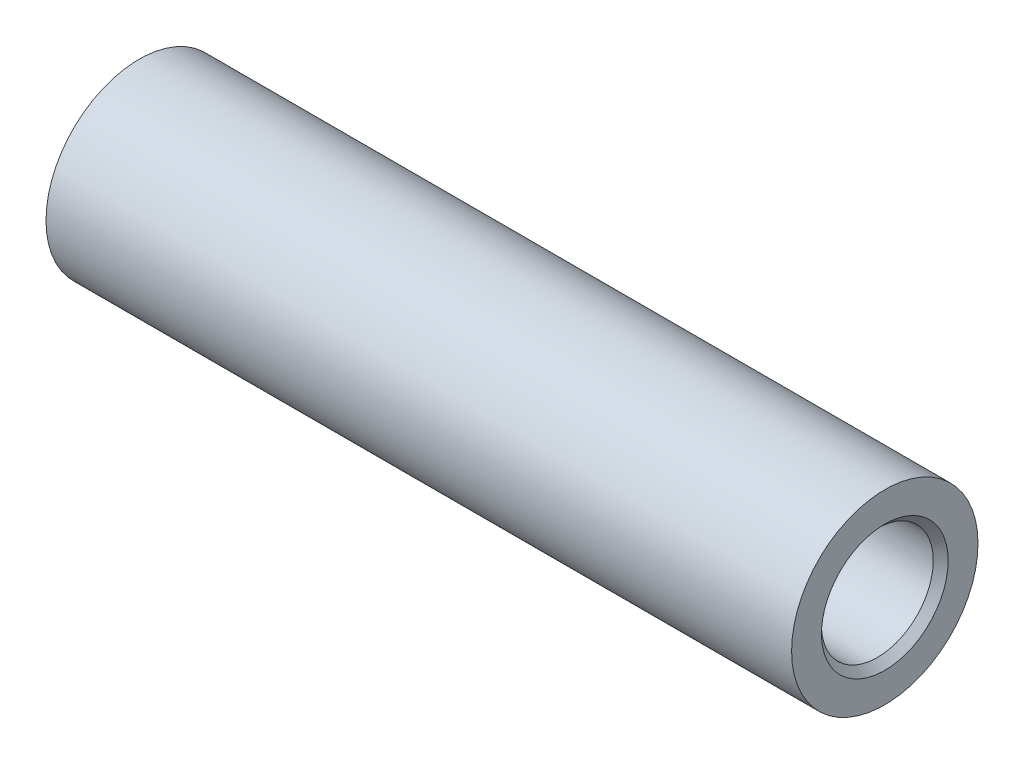
ISO-10303-21;
HEADER;
FILE_DESCRIPTION(('STEP AP214'),'2;1');
FILE_NAME('part.step','',(''),(''),'','','');
FILE_SCHEMA(('AUTOMOTIVE_DESIGN { 1 0 10303 214 1 1 1 1 }'));
ENDSEC;
DATA;
#1=APPLICATION_CONTEXT('core data for automotive mechanical design processes');
#2=APPLICATION_PROTOCOL_DEFINITION('international standard','automotive_design',2000,#1);
#3=PRODUCT_CONTEXT('',#1,'mechanical');
#4=PRODUCT('Part','Part','',(#3));
#5=PRODUCT_RELATED_PRODUCT_CATEGORY('part','',(#4));
#6=PRODUCT_DEFINITION_FORMATION('','',#4);
#7=PRODUCT_DEFINITION_CONTEXT('part definition',#1,'design');
#8=PRODUCT_DEFINITION('design','',#6,#7);
#9=PRODUCT_DEFINITION_SHAPE('','',#8);
#10=(LENGTH_UNIT() NAMED_UNIT(*) SI_UNIT(.MILLI.,.METRE.));
#11=(NAMED_UNIT(*) PLANE_ANGLE_UNIT() SI_UNIT($,.RADIAN.));
#12=(NAMED_UNIT(*) SI_UNIT($,.STERADIAN.) SOLID_ANGLE_UNIT());
#13=UNCERTAINTY_MEASURE_WITH_UNIT(LENGTH_MEASURE(1.E-05),#10,'distance_accuracy_value','');
#14=(GEOMETRIC_REPRESENTATION_CONTEXT(3) GLOBAL_UNCERTAINTY_ASSIGNED_CONTEXT((#13)) GLOBAL_UNIT_ASSIGNED_CONTEXT((#10,
#11,#12)) REPRESENTATION_CONTEXT('',''));
#15=CARTESIAN_POINT('',(0.,0.,0.));
#16=DIRECTION('',(0.,0.,1.));
#17=DIRECTION('',(1.,0.,0.));
#18=AXIS2_PLACEMENT_3D('',#15,#16,#17);
#19=CARTESIAN_POINT('',(14.,0.,0.));
#20=DIRECTION('',(-1.,0.,0.));
#21=DIRECTION('',(0.,0.,1.));
#22=AXIS2_PLACEMENT_3D('',#19,#20,#21);
#23=CYLINDRICAL_SURFACE('',#22,3.);
#24=CARTESIAN_POINT('',(14.,0.,0.));
#25=DIRECTION('',(1.,0.,0.));
#26=DIRECTION('',(0.,0.,-1.));
#27=AXIS2_PLACEMENT_3D('',#24,#25,#26);
#28=CIRCLE('',#27,3.);
#29=CARTESIAN_POINT('',(14.,2.9,-0.76811457478686));
#30=VERTEX_POINT('',#29);
#31=CARTESIAN_POINT('',(14.,2.9,0.76811457478686));
#32=VERTEX_POINT('',#31);
#33=EDGE_CURVE('E100',#30,#32,#28,.T.);
#34=ORIENTED_EDGE('',*,*,#33,.F.);
#35=CARTESIAN_POINT('',(14.,2.9,-0.76811457478686));
#36=CARTESIAN_POINT('',(13.9999789584772,2.8888825154748,-0.810100755105588));
#37=CARTESIAN_POINT('',(13.999534105873,2.87684201636774,-0.851863491293908));
#38=CARTESIAN_POINT('',(13.9971984735999,2.85092756123971,-0.934936904457714));
#39=CARTESIAN_POINT('',(13.995302495374,2.83704716204798,-0.976245413304694));
#40=CARTESIAN_POINT('',(13.9894346607372,2.80742922538918,-1.05842567704772));
#41=CARTESIAN_POINT('',(13.9854464419407,2.79167781776087,-1.09929136017827));
#42=CARTESIAN_POINT('',(13.9745676187644,2.75856505330542,-1.1799199271159));
#43=CARTESIAN_POINT('',(13.9676820012016,2.74120650244046,-1.21968458120183));
#44=CARTESIAN_POINT('',(13.9528477056787,2.71111249162953,-1.28479493758294));
#45=CARTESIAN_POINT('',(13.9460034236912,2.69874632232374,-1.31056061985513));
#46=CARTESIAN_POINT('',(13.9300796357831,2.67357190759928,-1.3611797936863));
#47=CARTESIAN_POINT('',(13.9210007198565,2.66076377963392,-1.38603352403417));
#48=CARTESIAN_POINT('',(13.8999787850709,2.63487079835345,-1.43464980790192));
#49=CARTESIAN_POINT('',(13.8880144748221,2.62178458026437,-1.45840260672594));
#50=CARTESIAN_POINT('',(13.8605491642566,2.59591143264303,-1.50396947292752));
#51=CARTESIAN_POINT('',(13.8450550611285,2.58312397236789,-1.52578720739983));
#52=CARTESIAN_POINT('',(13.8167431832872,2.56356426365419,-1.55831475689011));
#53=CARTESIAN_POINT('',(13.805304951426,2.55641941004599,-1.56999572193417));
#54=CARTESIAN_POINT('',(13.7806793127826,2.54285514514914,-1.591870659608));
#55=CARTESIAN_POINT('',(13.7674927120953,2.5364354020553,-1.60206531298905));
#56=CARTESIAN_POINT('',(13.7413638621843,2.52558585370028,-1.61910575868868));
#57=CARTESIAN_POINT('',(13.7286649692251,2.52100242870291,-1.62622295982801));
#58=CARTESIAN_POINT('',(13.7020660855099,2.51299288026296,-1.63857278402992));
#59=CARTESIAN_POINT('',(13.6881697982098,2.50956333866482,-1.64381097639642));
#60=CARTESIAN_POINT('',(13.6619927506422,2.50465148746657,-1.6512838537229));
#61=CARTESIAN_POINT('',(13.6498626165485,2.50293169256593,-1.65388647435974));
#62=CARTESIAN_POINT('',(13.6251656822776,2.50059432072725,-1.65741649993328));
#63=CARTESIAN_POINT('',(13.6125962571162,2.4999852511452,-1.65833097554296));
#64=CARTESIAN_POINT('',(13.6,2.5,-1.6583123951777));
#65=B_SPLINE_CURVE_WITH_KNOTS('',3,(#35,#36,#37,#38,#39,#40,#41,#42,#43,#44,#45,#46,#47,#48,#49,
#50,#51,#52,#53,#54,#55,#56,#57,#58,#59,#60,#61,#62,#63,#64),.UNSPECIFIED.,.F.,.F.,(4,2,2,2,2,2,
2,2,2,2,2,2,2,2,4),(0.,0.130319169378562,0.261107396055975,0.392934045586748,0.524534725636402,
0.612619427568844,0.70068089804577,0.789413205902345,0.877973596432687,0.931375188698685,
0.984752244937234,1.03036671734152,1.0758448509109,1.11325661876597,1.15095374928798),.UNSPECIFIED.);
#66=CARTESIAN_POINT('',(13.6,2.5,-1.6583123951777));
#67=VERTEX_POINT('',#66);
#68=EDGE_CURVE('E65',#30,#67,#65,.T.);
#69=ORIENTED_EDGE('',*,*,#68,.T.);
#70=DIRECTION('',(-1.,0.,0.));
#71=VECTOR('',#70,1.);
#72=CARTESIAN_POINT('',(14.,2.5,-1.6583123951777));
#73=LINE('',#72,#71);
#74=CARTESIAN_POINT('',(2.,2.5,-1.6583123951777));
#75=VERTEX_POINT('',#74);
#76=EDGE_CURVE('E95',#67,#75,#73,.T.);
#77=ORIENTED_EDGE('',*,*,#76,.T.);
#78=CARTESIAN_POINT('',(2.,0.,0.));
#79=DIRECTION('',(1.,0.,0.));
#80=DIRECTION('',(0.,0.,-1.));
#81=AXIS2_PLACEMENT_3D('',#78,#79,#80);
#82=CIRCLE('',#81,3.);
#83=CARTESIAN_POINT('',(2.,2.5,1.6583123951777));
#84=VERTEX_POINT('',#83);
#85=EDGE_CURVE('E99',#75,#84,#82,.T.);
#86=ORIENTED_EDGE('',*,*,#85,.T.);
#87=DIRECTION('',(-1.,0.,0.));
#88=VECTOR('',#87,1.);
#89=CARTESIAN_POINT('',(14.,2.5,1.6583123951777));
#90=LINE('',#89,#88);
#91=CARTESIAN_POINT('',(13.6,2.5,1.6583123951777));
#92=VERTEX_POINT('',#91);
#93=EDGE_CURVE('E87',#92,#84,#90,.T.);
#94=ORIENTED_EDGE('',*,*,#93,.F.);
#95=CARTESIAN_POINT('',(13.6,2.5,1.6583123951777));
#96=CARTESIAN_POINT('',(13.6154578985154,2.49996898467083,1.65835176816265));
#97=CARTESIAN_POINT('',(13.6308527606266,2.50089410778486,1.65696489829319));
#98=CARTESIAN_POINT('',(13.6608272747431,2.50437639091644,1.65170055528437));
#99=CARTESIAN_POINT('',(13.6754147426104,2.50691288566975,1.64785461485261));
#100=CARTESIAN_POINT('',(13.7034346184161,2.51333530385457,1.63804071810604));
#101=CARTESIAN_POINT('',(13.7168720017827,2.51721500545814,1.63208254281317));
#102=CARTESIAN_POINT('',(13.7425147173554,2.5260033006335,1.61844805041213));
#103=CARTESIAN_POINT('',(13.7547158117338,2.53091526683572,1.61076609562883));
#104=CARTESIAN_POINT('',(13.7837555493348,2.54418436887103,1.58976317052923));
#105=CARTESIAN_POINT('',(13.7997474393684,2.55301318303952,1.57557528296851));
#106=CARTESIAN_POINT('',(13.8289703599549,2.57156024680959,1.54512130312307));
#107=CARTESIAN_POINT('',(13.8421956568933,2.5812802846571,1.52885100539314));
#108=CARTESIAN_POINT('',(13.8748499114158,2.60815419649872,1.48278582801575));
#109=CARTESIAN_POINT('',(13.8919981451832,2.62567687316462,1.4516044193361));
#110=CARTESIAN_POINT('',(13.9211509014557,2.66046688356388,1.38682547610252));
#111=CARTESIAN_POINT('',(13.9331412354435,2.67773338838411,1.35322157003494));
#112=CARTESIAN_POINT('',(13.9533959207294,2.71157602406917,1.28407709516734));
#113=CARTESIAN_POINT('',(13.9616145198423,2.72814157253934,1.2485183196795));
#114=CARTESIAN_POINT('',(13.9751199325305,2.76005344673559,1.17629413452807));
#115=CARTESIAN_POINT('',(13.9804035732908,2.77539843769789,1.13962757225758));
#116=CARTESIAN_POINT('',(13.9887800712218,2.80470040142982,1.06547944263205));
#117=CARTESIAN_POINT('',(13.9918713419713,2.81865636281889,1.02799730529111));
#118=CARTESIAN_POINT('',(13.996439151951,2.84508445346929,0.952416784246038));
#119=CARTESIAN_POINT('',(13.9979154801995,2.85755638866249,0.914318320682471));
#120=CARTESIAN_POINT('',(13.999238241787,2.87472733403593,0.858075381299133));
#121=CARTESIAN_POINT('',(13.9995340044567,2.88002578329809,0.840120244735741));
#122=CARTESIAN_POINT('',(13.9999144039684,2.89027162801512,0.804163121422028));
#123=CARTESIAN_POINT('',(13.9999996402013,2.89521998106626,0.786161414095593));
#124=CARTESIAN_POINT('',(14.,2.9,0.768114574786861));
#125=B_SPLINE_CURVE_WITH_KNOTS('',3,(#95,#96,#97,#98,#99,#100,#101,#102,#103,#104,#105,#106,
#107,#108,#109,#110,#111,#112,#113,#114,#115,#116,#117,#118,#119,#120,#121,#122,#123,#124),
.UNSPECIFIED.,.F.,.F.,(4,2,2,2,2,2,2,2,2,2,2,2,2,2,4),(0.,0.0461842153836393,0.0917877727961553,
0.137182856685251,0.182728628392015,0.251725047031356,0.32086307057676,0.43919036753015,
0.557841113295256,0.677895372393875,0.798079163931827,0.918349833194023,1.03863621317213,
1.09480145111892,1.15080659545501),.UNSPECIFIED.);
#126=EDGE_CURVE('E108',#92,#32,#125,.T.);
#127=ORIENTED_EDGE('',*,*,#126,.T.);
#128=EDGE_LOOP('',(#34,#69,#77,#86,#94,#127));
#129=FACE_BOUND('',#128,.T.);
#130=ADVANCED_FACE('F56',(#129),#23,.T.);
#131=CARTESIAN_POINT('',(14.,2.5,1.6583123951777));
#132=DIRECTION('',(0.,1.,0.));
#133=DIRECTION('',(0.,0.,1.));
#134=AXIS2_PLACEMENT_3D('',#131,#132,#133);
#135=PLANE('',#134);
#136=ORIENTED_EDGE('',*,*,#76,.F.);
#137=DIRECTION('',(0.,0.,-1.));
#138=VECTOR('',#137,1.);
#139=CARTESIAN_POINT('',(13.6,2.5,1.6583123951777));
#140=LINE('',#139,#138);
#141=EDGE_CURVE('E12',#67,#92,#140,.F.);
#142=ORIENTED_EDGE('',*,*,#141,.T.);
#143=ORIENTED_EDGE('',*,*,#93,.T.);
#144=DIRECTION('',(0.,0.,-1.));
#145=VECTOR('',#144,1.);
#146=CARTESIAN_POINT('',(2.,2.5,1.6583123951777));
#147=LINE('',#146,#145);
#148=EDGE_CURVE('E90',#84,#75,#147,.T.);
#149=ORIENTED_EDGE('',*,*,#148,.T.);
#150=EDGE_LOOP('',(#136,#142,#143,#149));
#151=FACE_BOUND('',#150,.T.);
#152=ADVANCED_FACE('F89',(#151),#135,.F.);
#153=CARTESIAN_POINT('',(14.,0.,0.));
#154=DIRECTION('',(1.,0.,0.));
#155=DIRECTION('',(0.,0.,-1.));
#156=AXIS2_PLACEMENT_3D('',#153,#154,#155);
#157=PLANE('',#156);
#158=ORIENTED_EDGE('',*,*,#33,.T.);
#159=DIRECTION('',(0.,0.,-1.));
#160=VECTOR('',#159,1.);
#161=CARTESIAN_POINT('',(14.,2.9,-1.6583123951777));
#162=LINE('',#161,#160);
#163=EDGE_CURVE('E94',#32,#30,#162,.T.);
#164=ORIENTED_EDGE('',*,*,#163,.T.);
#165=EDGE_LOOP('',(#158,#164));
#166=FACE_BOUND('',#165,.T.);
#167=ADVANCED_FACE('F123',(#166),#157,.T.);
#168=CARTESIAN_POINT('',(2.,0.,0.));
#169=DIRECTION('',(1.,0.,0.));
#170=DIRECTION('',(0.,0.,-1.));
#171=AXIS2_PLACEMENT_3D('',#168,#169,#170);
#172=PLANE('',#171);
#173=ORIENTED_EDGE('',*,*,#85,.F.);
#174=ORIENTED_EDGE('',*,*,#148,.F.);
#175=EDGE_LOOP('',(#173,#174));
#176=FACE_BOUND('',#175,.T.);
#177=ADVANCED_FACE('F98',(#176),#172,.F.);
#178=CARTESIAN_POINT('',(13.6,2.9,0.));
#179=DIRECTION('',(0.,0.,1.));
#180=DIRECTION('',(1.,0.,0.));
#181=AXIS2_PLACEMENT_3D('',#178,#179,#180);
#182=CYLINDRICAL_SURFACE('',#181,0.4);
#183=ORIENTED_EDGE('',*,*,#126,.F.);
#184=ORIENTED_EDGE('',*,*,#141,.F.);
#185=ORIENTED_EDGE('',*,*,#68,.F.);
#186=ORIENTED_EDGE('',*,*,#163,.F.);
#187=EDGE_LOOP('',(#183,#184,#185,#186));
#188=FACE_BOUND('',#187,.T.);
#189=ADVANCED_FACE('F58',(#188),#182,.T.);
#190=CLOSED_SHELL('',(#130,#152,#167,#177,#189));
#191=MANIFOLD_SOLID_BREP('B2',#190);
#192=CARTESIAN_POINT('',(0.,0.,0.));
#193=DIRECTION('',(-1.,0.,0.));
#194=DIRECTION('',(0.,0.,1.));
#195=AXIS2_PLACEMENT_3D('',#192,#193,#194);
#196=CYLINDRICAL_SURFACE('',#195,4.);
#197=CARTESIAN_POINT('',(-20.6,0.,0.));
#198=DIRECTION('',(1.,0.,0.));
#199=DIRECTION('',(0.,0.,-1.));
#200=AXIS2_PLACEMENT_3D('',#197,#198,#199);
#201=CIRCLE('',#200,4.);
#202=CARTESIAN_POINT('',(-20.6,0.,-4.));
#203=VERTEX_POINT('',#202);
#204=EDGE_CURVE('E253',#203,#203,#201,.F.);
#205=ORIENTED_EDGE('',*,*,#204,.T.);
#206=EDGE_LOOP('',(#205));
#207=FACE_BOUND('',#206,.T.);
#208=DIRECTION('',(1.,0.,0.));
#209=VECTOR('',#208,1.);
#210=CARTESIAN_POINT('',(-15.,3.52019103303803,-1.89954075789877));
#211=LINE('',#210,#209);
#212=CARTESIAN_POINT('',(-14.6,3.52019103303803,-1.89954075789877));
#213=VERTEX_POINT('',#212);
#214=CARTESIAN_POINT('',(0.,3.52019103303803,-1.89954075789877));
#215=VERTEX_POINT('',#214);
#216=EDGE_CURVE('E218',#213,#215,#211,.T.);
#217=ORIENTED_EDGE('',*,*,#216,.F.);
#218=CARTESIAN_POINT('',(-14.6,3.52019103303803,-1.89954075789877));
#219=CARTESIAN_POINT('',(-14.6116614824023,3.5201764461889,-1.89956488223313));
#220=CARTESIAN_POINT('',(-14.6232920812814,3.52069049513344,-1.89861527042977));
#221=CARTESIAN_POINT('',(-14.6460968299247,3.52264889089818,-1.89498068510936));
#222=CARTESIAN_POINT('',(-14.6572741115758,3.52408495213073,-1.8923111666561));
#223=CARTESIAN_POINT('',(-14.6789620883429,3.52775887937614,-1.88545253464626));
#224=CARTESIAN_POINT('',(-14.6894746761275,3.52999433582866,-1.88126798726679));
#225=CARTESIAN_POINT('',(-14.70975696888,3.53510839801618,-1.87164066719997));
#226=CARTESIAN_POINT('',(-14.7195248679778,3.53798850443526,-1.86619495760394));
#227=CARTESIAN_POINT('',(-14.7447067792964,3.5463907834126,-1.85019979817946));
#228=CARTESIAN_POINT('',(-14.7593764635385,3.5523665214482,-1.83871828803551));
#229=CARTESIAN_POINT('',(-14.7865590700061,3.56513923406371,-1.81383038896207));
#230=CARTESIAN_POINT('',(-14.7990657788929,3.57193848214667,-1.80041865104539));
#231=CARTESIAN_POINT('',(-14.8310100318342,3.59131069336429,-1.76160277953385));
#232=CARTESIAN_POINT('',(-14.8484895206217,3.60434382440976,-1.7348321672844));
#233=CARTESIAN_POINT('',(-14.8791346314465,3.63065205179391,-1.67908563027633));
#234=CARTESIAN_POINT('',(-14.8922896445128,3.64392766008496,-1.65010449380808));
#235=CARTESIAN_POINT('',(-14.91601313718,3.67099002883189,-1.58902853083912));
#236=CARTESIAN_POINT('',(-14.9263830510744,3.68476069211196,-1.55685089240556));
#237=CARTESIAN_POINT('',(-14.9443456651604,3.71170709303606,-1.49147066409774));
#238=CARTESIAN_POINT('',(-14.951935210545,3.72488214008949,-1.45826695598917));
#239=CARTESIAN_POINT('',(-14.9649743112151,3.7505039233694,-1.39104931566184));
#240=CARTESIAN_POINT('',(-14.970416915403,3.76294818465154,-1.35703312379626));
#241=CARTESIAN_POINT('',(-14.9795994047423,3.78697440334096,-1.28846662414488));
#242=CARTESIAN_POINT('',(-14.9833387173289,3.79855606969256,-1.25391614078536));
#243=CARTESIAN_POINT('',(-14.9918319141345,3.82927855591948,-1.15791082528455));
#244=CARTESIAN_POINT('',(-14.9951869545386,3.8474530357412,-1.09602046755533));
#245=CARTESIAN_POINT('',(-14.9982437817516,3.87236576127751,-1.00289736436852));
#246=CARTESIAN_POINT('',(-14.9989349834461,3.88024064140586,-0.971983216141218));
#247=CARTESIAN_POINT('',(-14.9998122382191,3.89524762264255,-0.909979125800552));
#248=CARTESIAN_POINT('',(-14.9999984681428,3.90237998294554,-0.878889249052022));
#249=CARTESIAN_POINT('',(-15.,3.90914028820434,-0.847715876421883));
#250=B_SPLINE_CURVE_WITH_KNOTS('',3,(#218,#219,#220,#221,#222,#223,#224,#225,#226,#227,#228,
#229,#230,#231,#232,#233,#234,#235,#236,#237,#238,#239,#240,#241,#242,#243,#244,#245,#246,#247,
#248,#249),.UNSPECIFIED.,.F.,.F.,(4,2,2,2,2,2,2,2,2,2,2,2,2,2,2,4),(0.,0.0348854732574557,
0.0694617573961153,0.103934687222563,0.138488717177539,0.196839295173234,0.255354802466503,
0.358349917409163,0.461595850407362,0.570937474602905,0.68040278422662,0.79021965383999,
0.900073411410988,1.09365303741305,1.18937111668448,1.28505567039507),.UNSPECIFIED.);
#251=CARTESIAN_POINT('',(-15.,3.90914028820434,-0.847715876421883));
#252=VERTEX_POINT('',#251);
#253=EDGE_CURVE('E54',#213,#252,#250,.T.);
#254=ORIENTED_EDGE('',*,*,#253,.T.);
#255=CARTESIAN_POINT('',(-15.,0.,0.));
#256=DIRECTION('',(-1.,0.,0.));
#257=DIRECTION('',(0.,0.,1.));
#258=AXIS2_PLACEMENT_3D('',#255,#256,#257);
#259=CIRCLE('',#258,4.);
#260=CARTESIAN_POINT('',(-15.,3.89042753135794,0.929824512073186));
#261=VERTEX_POINT('',#260);
#262=EDGE_CURVE('E219',#261,#252,#259,.T.);
#263=ORIENTED_EDGE('',*,*,#262,.F.);
#264=CARTESIAN_POINT('',(-15.,3.89042753135794,0.929824512073186));
#265=CARTESIAN_POINT('',(-14.9999973598849,3.8827330664573,0.962019518398218));
#266=CARTESIAN_POINT('',(-14.9997974002428,3.87463839733203,0.994119330244581));
#267=CARTESIAN_POINT('',(-14.9988481229907,3.85765359976942,1.05811371484469));
#268=CARTESIAN_POINT('',(-14.9980985732967,3.84876313667244,1.09000819514812));
#269=CARTESIAN_POINT('',(-14.9947643857997,3.82067112896549,1.18615790143955));
#270=CARTESIAN_POINT('',(-14.9910858755848,3.80025199928189,1.25002898880682));
#271=CARTESIAN_POINT('',(-14.9789633412229,3.75564556953242,1.37835747472784));
#272=CARTESIAN_POINT('',(-14.9703720442663,3.73135939065718,1.44276935038567));
#273=CARTESIAN_POINT('',(-14.9516926635237,3.69296921817883,1.53724815012071));
#274=CARTESIAN_POINT('',(-14.9445278022874,3.67988351934572,1.5683038177959));
#275=CARTESIAN_POINT('',(-14.927732839847,3.65319495780275,1.62950168878891));
#276=CARTESIAN_POINT('',(-14.9181052491907,3.63959263370332,1.65964478760385));
#277=CARTESIAN_POINT('',(-14.8991975438401,3.61645589432079,1.70931104792842));
#278=CARTESIAN_POINT('',(-14.8907643950112,3.6069906627966,1.72918689601367));
#279=CARTESIAN_POINT('',(-14.872083430593,3.58808425956732,1.76808301961957));
#280=CARTESIAN_POINT('',(-14.8618364987489,3.57864307840622,1.78710370617376));
#281=CARTESIAN_POINT('',(-14.8390271774333,3.55993092158633,1.82409571764368));
#282=CARTESIAN_POINT('',(-14.8264448472,3.55066223161341,1.84205610224457));
#283=CARTESIAN_POINT('',(-14.7985266969063,3.53280040563476,1.87608282523212));
#284=CARTESIAN_POINT('',(-14.783198269795,3.52420554275866,1.89215406171604));
#285=CARTESIAN_POINT('',(-14.7564259237396,3.51173155375575,1.91515934164383));
#286=CARTESIAN_POINT('',(-14.7460614001155,3.50738989121858,1.92309266069076));
#287=CARTESIAN_POINT('',(-14.7241725119148,3.49938099099484,1.93762771347564));
#288=CARTESIAN_POINT('',(-14.7126478218319,3.49571394340462,1.94422907193768));
#289=CARTESIAN_POINT('',(-14.6883430730271,3.48927876835346,1.95575513737178));
#290=CARTESIAN_POINT('',(-14.6755487707823,3.48652281308588,1.96065718041757));
#291=CARTESIAN_POINT('',(-14.6491206656633,3.48227912056254,1.96818483774612));
#292=CARTESIAN_POINT('',(-14.6354901355144,3.48078674009281,1.97081878712626));
#293=CARTESIAN_POINT('',(-14.6181130575507,3.4798222462488,1.97252050361897));
#294=CARTESIAN_POINT('',(-14.6144966965046,3.4796720057284,1.97278552402495));
#295=CARTESIAN_POINT('',(-14.6072541517778,3.47947157233659,1.97313903950142));
#296=CARTESIAN_POINT('',(-14.6036279730009,3.47942133638472,1.97322761058364));
#297=CARTESIAN_POINT('',(-14.6,3.47942111272299,1.97322799502178));
#298=B_SPLINE_CURVE_WITH_KNOTS('',3,(#264,#265,#266,#267,#268,#269,#270,#271,#272,#273,#274,
#275,#276,#277,#278,#279,#280,#281,#282,#283,#284,#285,#286,#287,#288,#289,#290,#291,#292,#293,
#294,#295,#296,#297),.UNSPECIFIED.,.F.,.F.,(4,2,2,2,2,2,2,2,2,2,2,2,2,2,2,2,4),(0.,
0.0993016314144946,0.198645220668611,0.399950479264695,0.607632784808472,0.710919252330386,
0.814100844601348,0.88475997508645,0.955384772004795,1.02664292704777,1.09771204984628,
1.13887724626825,1.18005402471496,1.22176056975021,1.26331318371547,1.27419680507793,
1.28507573692429),.UNSPECIFIED.);
#299=CARTESIAN_POINT('',(-14.6,3.47942111272299,1.97322799502174));
#300=VERTEX_POINT('',#299);
#301=EDGE_CURVE('E190',#261,#300,#298,.T.);
#302=ORIENTED_EDGE('',*,*,#301,.T.);
#303=DIRECTION('',(1.,0.,0.));
#304=VECTOR('',#303,1.);
#305=CARTESIAN_POINT('',(-15.,3.47942111272299,1.97322799502174));
#306=LINE('',#305,#304);
#307=CARTESIAN_POINT('',(0.,3.47942111272299,1.97322799502174));
#308=VERTEX_POINT('',#307);
#309=EDGE_CURVE('E213',#300,#308,#306,.T.);
#310=ORIENTED_EDGE('',*,*,#309,.T.);
#311=CARTESIAN_POINT('',(0.,0.,0.));
#312=DIRECTION('',(-1.,0.,0.));
#313=DIRECTION('',(0.,0.,1.));
#314=AXIS2_PLACEMENT_3D('',#311,#312,#313);
#315=CIRCLE('',#314,4.);
#316=EDGE_CURVE('E216',#215,#308,#315,.T.);
#317=ORIENTED_EDGE('',*,*,#316,.F.);
#318=EDGE_LOOP('',(#217,#254,#263,#302,#310,#317));
#319=FACE_BOUND('',#318,.T.);
#320=ADVANCED_FACE('F175',(#207,#319),#196,.F.);
#321=CARTESIAN_POINT('',(0.,0.,0.));
#322=DIRECTION('',(-1.,0.,0.));
#323=DIRECTION('',(0.,0.,1.));
#324=AXIS2_PLACEMENT_3D('',#321,#322,#323);
#325=PLANE('',#324);
#326=ORIENTED_EDGE('',*,*,#316,.T.);
#327=DIRECTION('',(0.,-0.0105267481604234,0.999944592251574));
#328=VECTOR('',#327,1.);
#329=CARTESIAN_POINT('',(0.,3.52019103303803,-1.89954075789877));
#330=LINE('',#329,#328);
#331=EDGE_CURVE('E222',#215,#308,#330,.T.);
#332=ORIENTED_EDGE('',*,*,#331,.F.);
#333=EDGE_LOOP('',(#326,#332));
#334=FACE_BOUND('',#333,.T.);
#335=ADVANCED_FACE('F227',(#334),#325,.T.);
#336=CARTESIAN_POINT('',(-21.,0.,0.));
#337=DIRECTION('',(1.,0.,0.));
#338=DIRECTION('',(0.,0.,-1.));
#339=AXIS2_PLACEMENT_3D('',#336,#337,#338);
#340=CYLINDRICAL_SURFACE('',#339,5.);
#341=CARTESIAN_POINT('',(-21.,0.,0.));
#342=DIRECTION('',(1.,0.,0.));
#343=DIRECTION('',(0.,0.,-1.));
#344=AXIS2_PLACEMENT_3D('',#341,#342,#343);
#345=CIRCLE('',#344,5.);
#346=CARTESIAN_POINT('',(-21.,0.,-5.));
#347=VERTEX_POINT('',#346);
#348=EDGE_CURVE('E241',#347,#347,#345,.T.);
#349=CARTESIAN_POINT('',(19.,0.,0.));
#350=DIRECTION('',(1.,0.,0.));
#351=DIRECTION('',(0.,0.,-1.));
#352=AXIS2_PLACEMENT_3D('',#349,#350,#351);
#353=CIRCLE('',#352,5.);
#354=CARTESIAN_POINT('',(19.,0.,-5.));
#355=VERTEX_POINT('',#354);
#356=EDGE_CURVE('E234',#355,#355,#353,.T.);
#357=CARTESIAN_POINT('',(-21.,0.,-5.));
#358=CARTESIAN_POINT('',(-20.5833333333333,0.,-5.));
#359=CARTESIAN_POINT('',(-20.1666666666667,0.,-5.));
#360=CARTESIAN_POINT('',(-19.3333333333333,0.,-5.));
#361=CARTESIAN_POINT('',(-18.9166666666667,0.,-5.));
#362=CARTESIAN_POINT('',(-18.0833333333333,0.,-5.));
#363=CARTESIAN_POINT('',(-17.6666666666667,0.,-5.));
#364=CARTESIAN_POINT('',(-16.8333333333333,0.,-5.));
#365=CARTESIAN_POINT('',(-16.4166666666667,0.,-5.));
#366=CARTESIAN_POINT('',(-15.5833333333333,0.,-5.));
#367=CARTESIAN_POINT('',(-15.1666666666667,0.,-5.));
#368=CARTESIAN_POINT('',(-14.3333333333333,0.,-5.));
#369=CARTESIAN_POINT('',(-13.9166666666667,0.,-5.));
#370=CARTESIAN_POINT('',(-13.0833333333333,0.,-5.));
#371=CARTESIAN_POINT('',(-12.6666666666667,0.,-5.));
#372=CARTESIAN_POINT('',(-11.8333333333333,0.,-5.));
#373=CARTESIAN_POINT('',(-11.4166666666667,0.,-5.));
#374=CARTESIAN_POINT('',(-10.5833333333333,0.,-5.));
#375=CARTESIAN_POINT('',(-10.1666666666667,0.,-5.));
#376=CARTESIAN_POINT('',(-9.33333333333334,0.,-5.));
#377=CARTESIAN_POINT('',(-8.91666666666667,0.,-5.));
#378=CARTESIAN_POINT('',(-8.08333333333334,0.,-5.));
#379=CARTESIAN_POINT('',(-7.66666666666667,0.,-5.));
#380=CARTESIAN_POINT('',(-6.83333333333334,0.,-5.));
#381=CARTESIAN_POINT('',(-6.41666666666667,0.,-5.));
#382=CARTESIAN_POINT('',(-5.58333333333334,0.,-5.));
#383=CARTESIAN_POINT('',(-5.16666666666667,0.,-5.));
#384=CARTESIAN_POINT('',(-4.33333333333334,0.,-5.));
#385=CARTESIAN_POINT('',(-3.91666666666667,0.,-5.));
#386=CARTESIAN_POINT('',(-3.08333333333334,0.,-5.));
#387=CARTESIAN_POINT('',(-2.66666666666667,0.,-5.));
#388=CARTESIAN_POINT('',(-1.83333333333334,0.,-5.));
#389=CARTESIAN_POINT('',(-1.41666666666667,0.,-5.));
#390=CARTESIAN_POINT('',(-0.583333333333337,0.,-5.));
#391=CARTESIAN_POINT('',(-0.16666666666667,0.,-5.));
#392=CARTESIAN_POINT('',(0.666666666666664,0.,-5.));
#393=CARTESIAN_POINT('',(1.08333333333333,0.,-5.));
#394=CARTESIAN_POINT('',(1.91666666666666,0.,-5.));
#395=CARTESIAN_POINT('',(2.33333333333333,0.,-5.));
#396=CARTESIAN_POINT('',(3.16666666666666,0.,-5.));
#397=CARTESIAN_POINT('',(3.58333333333333,0.,-5.));
#398=CARTESIAN_POINT('',(4.41666666666666,0.,-5.));
#399=CARTESIAN_POINT('',(4.83333333333333,0.,-5.));
#400=CARTESIAN_POINT('',(5.66666666666666,0.,-5.));
#401=CARTESIAN_POINT('',(6.08333333333333,0.,-5.));
#402=CARTESIAN_POINT('',(6.91666666666666,0.,-5.));
#403=CARTESIAN_POINT('',(7.33333333333333,0.,-5.));
#404=CARTESIAN_POINT('',(8.16666666666666,0.,-5.));
#405=CARTESIAN_POINT('',(8.58333333333333,0.,-5.));
#406=CARTESIAN_POINT('',(9.41666666666667,0.,-5.));
#407=CARTESIAN_POINT('',(9.83333333333333,0.,-5.));
#408=CARTESIAN_POINT('',(10.6666666666667,0.,-5.));
#409=CARTESIAN_POINT('',(11.0833333333333,0.,-5.));
#410=CARTESIAN_POINT('',(11.9166666666667,0.,-5.));
#411=CARTESIAN_POINT('',(12.3333333333333,0.,-5.));
#412=CARTESIAN_POINT('',(13.1666666666667,0.,-5.));
#413=CARTESIAN_POINT('',(13.5833333333333,0.,-5.));
#414=CARTESIAN_POINT('',(14.4166666666667,0.,-5.));
#415=CARTESIAN_POINT('',(14.8333333333333,0.,-5.));
#416=CARTESIAN_POINT('',(15.6666666666667,0.,-5.));
#417=CARTESIAN_POINT('',(16.0833333333333,0.,-5.));
#418=CARTESIAN_POINT('',(16.9166666666667,0.,-5.));
#419=CARTESIAN_POINT('',(17.3333333333333,0.,-5.));
#420=CARTESIAN_POINT('',(18.1666666666667,0.,-5.));
#421=CARTESIAN_POINT('',(18.5833333333333,0.,-5.));
#422=CARTESIAN_POINT('',(19.,0.,-5.));
#423=B_SPLINE_CURVE_WITH_KNOTS('',3,(#357,#358,#359,#360,#361,#362,#363,#364,#365,#366,#367,
#368,#369,#370,#371,#372,#373,#374,#375,#376,#377,#378,#379,#380,#381,#382,#383,#384,#385,#386,
#387,#388,#389,#390,#391,#392,#393,#394,#395,#396,#397,#398,#399,#400,#401,#402,#403,#404,#405,
#406,#407,#408,#409,#410,#411,#412,#413,#414,#415,#416,#417,#418,#419,#420,#421,#422),
.UNSPECIFIED.,.F.,.F.,(4,2,2,2,2,2,2,2,2,2,2,2,2,2,2,2,2,2,2,2,2,2,2,2,2,2,2,2,2,2,2,2,4),(0.,
1.25,2.5,3.75,5.,6.25,7.5,8.75,10.,11.25,12.5,13.75,15.,16.25,17.5,18.75,20.,21.25,22.5,23.75,
25.,26.25,27.5,28.75,30.,31.25,32.5,33.75,35.,36.25,37.5,38.75,40.),.UNSPECIFIED.);
#424=EDGE_CURVE('BSEAM293',#347,#355,#423,.T.);
#425=ORIENTED_EDGE('',*,*,#348,.T.);
#426=ORIENTED_EDGE('',*,*,#356,.F.);
#427=ORIENTED_EDGE('',*,*,#424,.T.);
#428=ORIENTED_EDGE('',*,*,#424,.F.);
#429=EDGE_LOOP('',(#425,#427,#426,#428));
#430=FACE_BOUND('',#429,.T.);
#431=ADVANCED_FACE('F293',(#430),#340,.T.);
#432=CARTESIAN_POINT('',(-21.,0.,0.));
#433=DIRECTION('',(1.,0.,0.));
#434=DIRECTION('',(0.,0.,-1.));
#435=AXIS2_PLACEMENT_3D('',#432,#433,#434);
#436=PLANE('',#435);
#437=CARTESIAN_POINT('',(-21.,0.,0.));
#438=DIRECTION('',(1.,0.,0.));
#439=DIRECTION('',(0.,0.,-1.));
#440=AXIS2_PLACEMENT_3D('',#437,#438,#439);
#441=CIRCLE('',#440,4.40000000000003);
#442=CARTESIAN_POINT('',(-21.,0.,-4.40000000000003));
#443=VERTEX_POINT('',#442);
#444=EDGE_CURVE('E257',#443,#443,#441,.T.);
#445=ORIENTED_EDGE('',*,*,#444,.T.);
#446=EDGE_LOOP('',(#445));
#447=FACE_BOUND('',#446,.T.);
#448=ORIENTED_EDGE('',*,*,#348,.F.);
#449=EDGE_LOOP('',(#448));
#450=FACE_BOUND('',#449,.T.);
#451=ADVANCED_FACE('F289',(#447,#450),#436,.F.);
#452=CARTESIAN_POINT('',(19.,0.,0.));
#453=DIRECTION('',(1.,0.,0.));
#454=DIRECTION('',(0.,0.,-1.));
#455=AXIS2_PLACEMENT_3D('',#452,#453,#454);
#456=PLANE('',#455);
#457=CARTESIAN_POINT('',(19.,0.,0.));
#458=DIRECTION('',(1.,0.,0.));
#459=DIRECTION('',(0.,0.,-1.));
#460=AXIS2_PLACEMENT_3D('',#457,#458,#459);
#461=CIRCLE('',#460,3.4);
#462=CARTESIAN_POINT('',(19.,0.,-3.4));
#463=VERTEX_POINT('',#462);
#464=EDGE_CURVE('E249',#463,#463,#461,.F.);
#465=ORIENTED_EDGE('',*,*,#464,.T.);
#466=EDGE_LOOP('',(#465));
#467=FACE_BOUND('',#466,.T.);
#468=ORIENTED_EDGE('',*,*,#356,.T.);
#469=EDGE_LOOP('',(#468));
#470=FACE_BOUND('',#469,.T.);
#471=ADVANCED_FACE('F285',(#467,#470),#456,.T.);
#472=CARTESIAN_POINT('',(2.,0.,0.));
#473=DIRECTION('',(1.,0.,0.));
#474=DIRECTION('',(0.,0.,-1.));
#475=AXIS2_PLACEMENT_3D('',#472,#473,#474);
#476=CYLINDRICAL_SURFACE('',#475,3.);
#477=CARTESIAN_POINT('',(18.6,0.,0.));
#478=DIRECTION('',(1.,0.,0.));
#479=DIRECTION('',(0.,0.,-1.));
#480=AXIS2_PLACEMENT_3D('',#477,#478,#479);
#481=CIRCLE('',#480,3.);
#482=CARTESIAN_POINT('',(18.6,0.,-3.));
#483=VERTEX_POINT('',#482);
#484=EDGE_CURVE('E245',#483,#483,#481,.T.);
#485=ORIENTED_EDGE('',*,*,#484,.T.);
#486=EDGE_LOOP('',(#485));
#487=FACE_BOUND('',#486,.T.);
#488=CARTESIAN_POINT('',(2.,0.,0.));
#489=DIRECTION('',(1.,0.,0.));
#490=DIRECTION('',(0.,0.,-1.));
#491=AXIS2_PLACEMENT_3D('',#488,#489,#490);
#492=CIRCLE('',#491,3.);
#493=CARTESIAN_POINT('',(2.,0.,-3.));
#494=VERTEX_POINT('',#493);
#495=EDGE_CURVE('E229',#494,#494,#492,.T.);
#496=ORIENTED_EDGE('',*,*,#495,.F.);
#497=EDGE_LOOP('',(#496));
#498=FACE_BOUND('',#497,.T.);
#499=ADVANCED_FACE('F281',(#487,#498),#476,.F.);
#500=CARTESIAN_POINT('',(2.,0.,0.));
#501=DIRECTION('',(1.,0.,0.));
#502=DIRECTION('',(0.,0.,-1.));
#503=AXIS2_PLACEMENT_3D('',#500,#501,#502);
#504=PLANE('',#503);
#505=ORIENTED_EDGE('',*,*,#495,.T.);
#506=EDGE_LOOP('',(#505));
#507=FACE_BOUND('',#506,.T.);
#508=ADVANCED_FACE('F277',(#507),#504,.T.);
#509=CARTESIAN_POINT('',(-15.,3.52019103303803,-1.89954075789877));
#510=DIRECTION('',(0.,0.999944592251574,0.0105267481604234));
#511=DIRECTION('',(0.,-0.0105267481604234,0.999944592251574));
#512=AXIS2_PLACEMENT_3D('',#509,#510,#511);
#513=PLANE('',#512);
#514=ORIENTED_EDGE('',*,*,#309,.F.);
#515=DIRECTION('',(0.,-0.0105267481604234,0.999944592251574));
#516=VECTOR('',#515,1.);
#517=CARTESIAN_POINT('',(-14.6,3.52019103303803,-1.89954075789877));
#518=LINE('',#517,#516);
#519=EDGE_CURVE('E197',#300,#213,#518,.F.);
#520=ORIENTED_EDGE('',*,*,#519,.T.);
#521=ORIENTED_EDGE('',*,*,#216,.T.);
#522=ORIENTED_EDGE('',*,*,#331,.T.);
#523=EDGE_LOOP('',(#514,#520,#521,#522));
#524=FACE_BOUND('',#523,.T.);
#525=ADVANCED_FACE('F223',(#524),#513,.F.);
#526=CARTESIAN_POINT('',(-15.,0.,0.));
#527=DIRECTION('',(-1.,0.,0.));
#528=DIRECTION('',(0.,0.,1.));
#529=AXIS2_PLACEMENT_3D('',#526,#527,#528);
#530=PLANE('',#529);
#531=ORIENTED_EDGE('',*,*,#262,.T.);
#532=DIRECTION('',(0.,-0.0105267481604234,0.999944592251574));
#533=VECTOR('',#532,1.);
#534=CARTESIAN_POINT('',(-15.,3.87939894962362,1.97743869428591));
#535=LINE('',#534,#533);
#536=EDGE_CURVE('E261',#252,#261,#535,.T.);
#537=ORIENTED_EDGE('',*,*,#536,.T.);
#538=EDGE_LOOP('',(#531,#537));
#539=FACE_BOUND('',#538,.T.);
#540=ADVANCED_FACE('F305',(#539),#530,.T.);
#541=CARTESIAN_POINT('',(18.6,0.,0.));
#542=DIRECTION('',(1.,0.,0.));
#543=DIRECTION('',(0.,0.,-1.));
#544=AXIS2_PLACEMENT_3D('',#541,#542,#543);
#545=CONICAL_SURFACE('',#544,3.,0.785398163397447);
#546=ORIENTED_EDGE('',*,*,#464,.F.);
#547=EDGE_LOOP('',(#546));
#548=FACE_BOUND('',#547,.T.);
#549=ORIENTED_EDGE('',*,*,#484,.F.);
#550=EDGE_LOOP('',(#549));
#551=FACE_BOUND('',#550,.T.);
#552=ADVANCED_FACE('F299',(#548,#551),#545,.F.);
#553=CARTESIAN_POINT('',(-20.6,0.,0.));
#554=DIRECTION('',(-1.,0.,0.));
#555=DIRECTION('',(0.,0.,1.));
#556=AXIS2_PLACEMENT_3D('',#553,#554,#555);
#557=CONICAL_SURFACE('',#556,4.,0.785398163397447);
#558=ORIENTED_EDGE('',*,*,#444,.F.);
#559=EDGE_LOOP('',(#558));
#560=FACE_BOUND('',#559,.T.);
#561=ORIENTED_EDGE('',*,*,#204,.F.);
#562=EDGE_LOOP('',(#561));
#563=FACE_BOUND('',#562,.T.);
#564=ADVANCED_FACE('F304',(#560,#563),#557,.F.);
#565=CARTESIAN_POINT('',(-14.6,3.89978390978114,0.0410543178256513));
#566=DIRECTION('',(0.,0.0105267481604234,-0.999944592251574));
#567=DIRECTION('',(0.,0.999944592251574,0.0105267481604234));
#568=AXIS2_PLACEMENT_3D('',#565,#566,#567);
#569=CYLINDRICAL_SURFACE('',#568,0.4);
#570=ORIENTED_EDGE('',*,*,#253,.F.);
#571=ORIENTED_EDGE('',*,*,#519,.F.);
#572=ORIENTED_EDGE('',*,*,#301,.F.);
#573=ORIENTED_EDGE('',*,*,#536,.F.);
#574=EDGE_LOOP('',(#570,#571,#572,#573));
#575=FACE_BOUND('',#574,.T.);
#576=ADVANCED_FACE('F177',(#575),#569,.T.);
#577=CLOSED_SHELL('',(#320,#335,#431,#451,#471,#499,#508,#525,#540,#552,#564,#576));
#578=MANIFOLD_SOLID_BREP('B6',#577);
#579=ADVANCED_BREP_SHAPE_REPRESENTATION('',(#18,#191,#578),#14);
#580=SHAPE_DEFINITION_REPRESENTATION(#9,#579);
ENDSEC;
END-ISO-10303-21;
